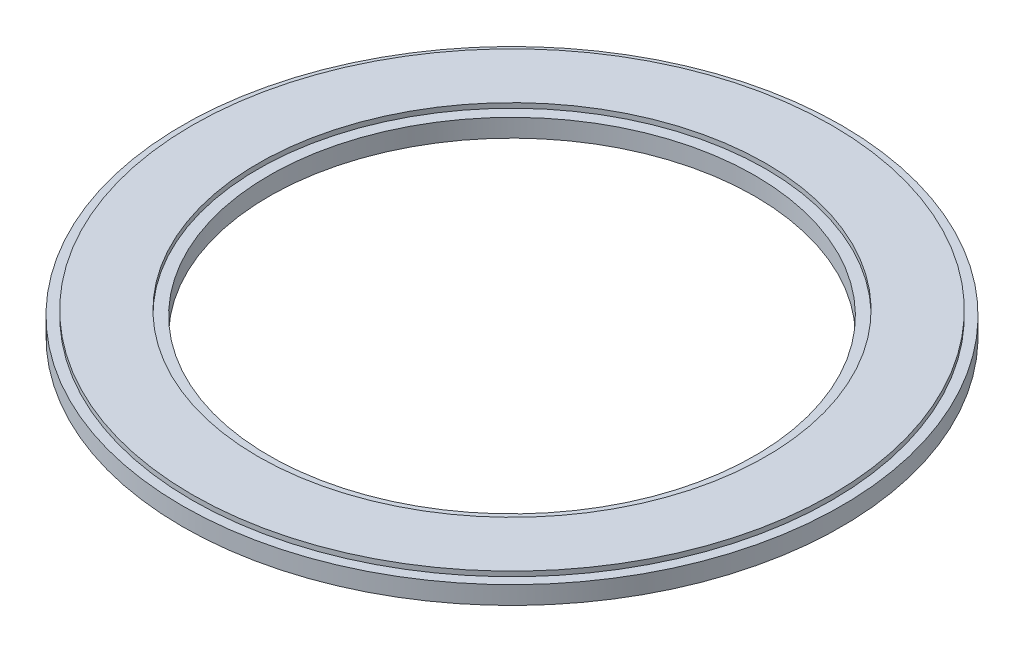
ISO-10303-21;
HEADER;
FILE_DESCRIPTION(('STEP AP214'),'2;1');
FILE_NAME('part.step','',(''),(''),'','','');
FILE_SCHEMA(('AUTOMOTIVE_DESIGN { 1 0 10303 214 1 1 1 1 }'));
ENDSEC;
DATA;
#1=APPLICATION_CONTEXT('core data for automotive mechanical design processes');
#2=APPLICATION_PROTOCOL_DEFINITION('international standard','automotive_design',2000,#1);
#3=PRODUCT_CONTEXT('',#1,'mechanical');
#4=PRODUCT('Part','Part','',(#3));
#5=PRODUCT_RELATED_PRODUCT_CATEGORY('part','',(#4));
#6=PRODUCT_DEFINITION_FORMATION('','',#4);
#7=PRODUCT_DEFINITION_CONTEXT('part definition',#1,'design');
#8=PRODUCT_DEFINITION('design','',#6,#7);
#9=PRODUCT_DEFINITION_SHAPE('','',#8);
#10=(LENGTH_UNIT() NAMED_UNIT(*) SI_UNIT(.MILLI.,.METRE.));
#11=(NAMED_UNIT(*) PLANE_ANGLE_UNIT() SI_UNIT($,.RADIAN.));
#12=(NAMED_UNIT(*) SI_UNIT($,.STERADIAN.) SOLID_ANGLE_UNIT());
#13=UNCERTAINTY_MEASURE_WITH_UNIT(LENGTH_MEASURE(1.E-05),#10,'distance_accuracy_value','');
#14=(GEOMETRIC_REPRESENTATION_CONTEXT(3) GLOBAL_UNCERTAINTY_ASSIGNED_CONTEXT((#13)) GLOBAL_UNIT_ASSIGNED_CONTEXT((#10,
#11,#12)) REPRESENTATION_CONTEXT('',''));
#15=CARTESIAN_POINT('',(0.,0.,0.));
#16=DIRECTION('',(0.,0.,1.));
#17=DIRECTION('',(1.,0.,0.));
#18=AXIS2_PLACEMENT_3D('',#15,#16,#17);
#19=CARTESIAN_POINT('',(0.,0.,0.));
#20=DIRECTION('',(0.,-1.,0.));
#21=DIRECTION('',(0.,0.,-1.));
#22=AXIS2_PLACEMENT_3D('',#19,#20,#21);
#23=CYLINDRICAL_SURFACE('',#22,36.6);
#24=CARTESIAN_POINT('',(0.,0.,0.));
#25=DIRECTION('',(0.,-1.,0.));
#26=DIRECTION('',(0.,0.,-1.));
#27=AXIS2_PLACEMENT_3D('',#24,#25,#26);
#28=CIRCLE('',#27,36.6);
#29=CARTESIAN_POINT('',(0.,0.,-36.6));
#30=VERTEX_POINT('',#29);
#31=EDGE_CURVE('E10',#30,#30,#28,.T.);
#32=ORIENTED_EDGE('',*,*,#31,.T.);
#33=EDGE_LOOP('',(#32));
#34=FACE_BOUND('',#33,.T.);
#35=CARTESIAN_POINT('',(0.,0.7,0.));
#36=DIRECTION('',(0.,-1.,0.));
#37=DIRECTION('',(0.,0.,-1.));
#38=AXIS2_PLACEMENT_3D('',#35,#36,#37);
#39=CIRCLE('',#38,36.6);
#40=CARTESIAN_POINT('',(0.,0.7,-36.6));
#41=VERTEX_POINT('',#40);
#42=EDGE_CURVE('E80',#41,#41,#39,.T.);
#43=ORIENTED_EDGE('',*,*,#42,.F.);
#44=EDGE_LOOP('',(#43));
#45=FACE_BOUND('',#44,.T.);
#46=ADVANCED_FACE('F39',(#34,#45),#23,.F.);
#47=CARTESIAN_POINT('',(36.6,0.,0.));
#48=DIRECTION('',(0.,-1.,0.));
#49=DIRECTION('',(0.,0.,-1.));
#50=AXIS2_PLACEMENT_3D('',#47,#48,#49);
#51=PLANE('',#50);
#52=CARTESIAN_POINT('',(0.,0.,0.));
#53=DIRECTION('',(0.,-1.,0.));
#54=DIRECTION('',(0.,0.,-1.));
#55=AXIS2_PLACEMENT_3D('',#52,#53,#54);
#56=CIRCLE('',#55,46.1);
#57=CARTESIAN_POINT('',(0.,0.,-46.1));
#58=VERTEX_POINT('',#57);
#59=EDGE_CURVE('E44',#58,#58,#56,.T.);
#60=ORIENTED_EDGE('',*,*,#59,.T.);
#61=EDGE_LOOP('',(#60));
#62=FACE_BOUND('',#61,.T.);
#63=ORIENTED_EDGE('',*,*,#31,.F.);
#64=EDGE_LOOP('',(#63));
#65=FACE_BOUND('',#64,.T.);
#66=ADVANCED_FACE('F87',(#62,#65),#51,.T.);
#67=CARTESIAN_POINT('',(0.,0.,0.));
#68=DIRECTION('',(0.,-1.,0.));
#69=DIRECTION('',(0.,0.,-1.));
#70=AXIS2_PLACEMENT_3D('',#67,#68,#69);
#71=CYLINDRICAL_SURFACE('',#70,46.1);
#72=CARTESIAN_POINT('',(0.,0.7,0.));
#73=DIRECTION('',(0.,-1.,0.));
#74=DIRECTION('',(0.,0.,-1.));
#75=AXIS2_PLACEMENT_3D('',#72,#73,#74);
#76=CIRCLE('',#75,46.1);
#77=CARTESIAN_POINT('',(0.,0.7,-46.1));
#78=VERTEX_POINT('',#77);
#79=EDGE_CURVE('E47',#78,#78,#76,.T.);
#80=ORIENTED_EDGE('',*,*,#79,.T.);
#81=EDGE_LOOP('',(#80));
#82=FACE_BOUND('',#81,.T.);
#83=ORIENTED_EDGE('',*,*,#59,.F.);
#84=EDGE_LOOP('',(#83));
#85=FACE_BOUND('',#84,.T.);
#86=ADVANCED_FACE('F93',(#82,#85),#71,.T.);
#87=CARTESIAN_POINT('',(46.1,0.7,0.));
#88=DIRECTION('',(0.,-1.,0.));
#89=DIRECTION('',(0.,0.,-1.));
#90=AXIS2_PLACEMENT_3D('',#87,#88,#89);
#91=PLANE('',#90);
#92=CARTESIAN_POINT('',(0.,0.7,0.));
#93=DIRECTION('',(0.,-1.,0.));
#94=DIRECTION('',(0.,0.,-1.));
#95=AXIS2_PLACEMENT_3D('',#92,#93,#94);
#96=CIRCLE('',#95,47.5);
#97=CARTESIAN_POINT('',(0.,0.7,-47.5));
#98=VERTEX_POINT('',#97);
#99=EDGE_CURVE('E52',#98,#98,#96,.T.);
#100=ORIENTED_EDGE('',*,*,#99,.T.);
#101=EDGE_LOOP('',(#100));
#102=FACE_BOUND('',#101,.T.);
#103=ORIENTED_EDGE('',*,*,#79,.F.);
#104=EDGE_LOOP('',(#103));
#105=FACE_BOUND('',#104,.T.);
#106=ADVANCED_FACE('F92',(#102,#105),#91,.T.);
#107=CARTESIAN_POINT('',(0.,0.,0.));
#108=DIRECTION('',(0.,-1.,0.));
#109=DIRECTION('',(0.,0.,-1.));
#110=AXIS2_PLACEMENT_3D('',#107,#108,#109);
#111=CYLINDRICAL_SURFACE('',#110,47.5);
#112=CARTESIAN_POINT('',(0.,3.3,0.));
#113=DIRECTION('',(0.,-1.,0.));
#114=DIRECTION('',(0.,0.,-1.));
#115=AXIS2_PLACEMENT_3D('',#112,#113,#114);
#116=CIRCLE('',#115,47.5);
#117=CARTESIAN_POINT('',(0.,3.3,-47.5));
#118=VERTEX_POINT('',#117);
#119=EDGE_CURVE('E59',#118,#118,#116,.T.);
#120=ORIENTED_EDGE('',*,*,#119,.T.);
#121=EDGE_LOOP('',(#120));
#122=FACE_BOUND('',#121,.T.);
#123=ORIENTED_EDGE('',*,*,#99,.F.);
#124=EDGE_LOOP('',(#123));
#125=FACE_BOUND('',#124,.T.);
#126=ADVANCED_FACE('F105',(#122,#125),#111,.T.);
#127=CARTESIAN_POINT('',(47.5,3.3,0.));
#128=DIRECTION('',(0.,1.,0.));
#129=DIRECTION('',(0.,0.,1.));
#130=AXIS2_PLACEMENT_3D('',#127,#128,#129);
#131=PLANE('',#130);
#132=CARTESIAN_POINT('',(0.,3.3,0.));
#133=DIRECTION('',(0.,-1.,0.));
#134=DIRECTION('',(0.,0.,-1.));
#135=AXIS2_PLACEMENT_3D('',#132,#133,#134);
#136=CIRCLE('',#135,46.1);
#137=CARTESIAN_POINT('',(0.,3.3,-46.1));
#138=VERTEX_POINT('',#137);
#139=EDGE_CURVE('E63',#138,#138,#136,.T.);
#140=ORIENTED_EDGE('',*,*,#139,.T.);
#141=EDGE_LOOP('',(#140));
#142=FACE_BOUND('',#141,.T.);
#143=ORIENTED_EDGE('',*,*,#119,.F.);
#144=EDGE_LOOP('',(#143));
#145=FACE_BOUND('',#144,.T.);
#146=ADVANCED_FACE('F106',(#142,#145),#131,.T.);
#147=CARTESIAN_POINT('',(0.,0.,0.));
#148=DIRECTION('',(0.,-1.,0.));
#149=DIRECTION('',(0.,0.,-1.));
#150=AXIS2_PLACEMENT_3D('',#147,#148,#149);
#151=CYLINDRICAL_SURFACE('',#150,46.1);
#152=CARTESIAN_POINT('',(0.,4.,0.));
#153=DIRECTION('',(0.,-1.,0.));
#154=DIRECTION('',(0.,0.,-1.));
#155=AXIS2_PLACEMENT_3D('',#152,#153,#154);
#156=CIRCLE('',#155,46.1);
#157=CARTESIAN_POINT('',(0.,4.,-46.1));
#158=VERTEX_POINT('',#157);
#159=EDGE_CURVE('E65',#158,#158,#156,.T.);
#160=ORIENTED_EDGE('',*,*,#159,.T.);
#161=EDGE_LOOP('',(#160));
#162=FACE_BOUND('',#161,.T.);
#163=ORIENTED_EDGE('',*,*,#139,.F.);
#164=EDGE_LOOP('',(#163));
#165=FACE_BOUND('',#164,.T.);
#166=ADVANCED_FACE('F109',(#162,#165),#151,.T.);
#167=CARTESIAN_POINT('',(46.1,4.,0.));
#168=DIRECTION('',(0.,1.,0.));
#169=DIRECTION('',(0.,0.,1.));
#170=AXIS2_PLACEMENT_3D('',#167,#168,#169);
#171=PLANE('',#170);
#172=CARTESIAN_POINT('',(0.,4.,0.));
#173=DIRECTION('',(0.,-1.,0.));
#174=DIRECTION('',(0.,0.,-1.));
#175=AXIS2_PLACEMENT_3D('',#172,#173,#174);
#176=CIRCLE('',#175,36.6);
#177=CARTESIAN_POINT('',(0.,4.,-36.6));
#178=VERTEX_POINT('',#177);
#179=EDGE_CURVE('E69',#178,#178,#176,.T.);
#180=ORIENTED_EDGE('',*,*,#179,.T.);
#181=EDGE_LOOP('',(#180));
#182=FACE_BOUND('',#181,.T.);
#183=ORIENTED_EDGE('',*,*,#159,.F.);
#184=EDGE_LOOP('',(#183));
#185=FACE_BOUND('',#184,.T.);
#186=ADVANCED_FACE('F111',(#182,#185),#171,.T.);
#187=CARTESIAN_POINT('',(0.,0.,0.));
#188=DIRECTION('',(0.,-1.,0.));
#189=DIRECTION('',(0.,0.,-1.));
#190=AXIS2_PLACEMENT_3D('',#187,#188,#189);
#191=CYLINDRICAL_SURFACE('',#190,36.6);
#192=CARTESIAN_POINT('',(0.,3.3,0.));
#193=DIRECTION('',(0.,-1.,0.));
#194=DIRECTION('',(0.,0.,-1.));
#195=AXIS2_PLACEMENT_3D('',#192,#193,#194);
#196=CIRCLE('',#195,36.6);
#197=CARTESIAN_POINT('',(0.,3.3,-36.6));
#198=VERTEX_POINT('',#197);
#199=EDGE_CURVE('E68',#198,#198,#196,.T.);
#200=ORIENTED_EDGE('',*,*,#199,.T.);
#201=EDGE_LOOP('',(#200));
#202=FACE_BOUND('',#201,.T.);
#203=ORIENTED_EDGE('',*,*,#179,.F.);
#204=EDGE_LOOP('',(#203));
#205=FACE_BOUND('',#204,.T.);
#206=ADVANCED_FACE('F117',(#202,#205),#191,.F.);
#207=CARTESIAN_POINT('',(36.6,3.3,0.));
#208=DIRECTION('',(0.,1.,0.));
#209=DIRECTION('',(0.,0.,1.));
#210=AXIS2_PLACEMENT_3D('',#207,#208,#209);
#211=PLANE('',#210);
#212=CARTESIAN_POINT('',(0.,3.3,0.));
#213=DIRECTION('',(0.,-1.,0.));
#214=DIRECTION('',(0.,0.,-1.));
#215=AXIS2_PLACEMENT_3D('',#212,#213,#214);
#216=CIRCLE('',#215,35.);
#217=CARTESIAN_POINT('',(0.,3.3,-35.));
#218=VERTEX_POINT('',#217);
#219=EDGE_CURVE('E71',#218,#218,#216,.T.);
#220=ORIENTED_EDGE('',*,*,#219,.T.);
#221=EDGE_LOOP('',(#220));
#222=FACE_BOUND('',#221,.T.);
#223=ORIENTED_EDGE('',*,*,#199,.F.);
#224=EDGE_LOOP('',(#223));
#225=FACE_BOUND('',#224,.T.);
#226=ADVANCED_FACE('F124',(#222,#225),#211,.T.);
#227=CARTESIAN_POINT('',(0.,0.,0.));
#228=DIRECTION('',(0.,-1.,0.));
#229=DIRECTION('',(0.,0.,-1.));
#230=AXIS2_PLACEMENT_3D('',#227,#228,#229);
#231=CYLINDRICAL_SURFACE('',#230,35.);
#232=CARTESIAN_POINT('',(0.,0.7,0.));
#233=DIRECTION('',(0.,-1.,0.));
#234=DIRECTION('',(0.,0.,-1.));
#235=AXIS2_PLACEMENT_3D('',#232,#233,#234);
#236=CIRCLE('',#235,35.);
#237=CARTESIAN_POINT('',(0.,0.7,-35.));
#238=VERTEX_POINT('',#237);
#239=EDGE_CURVE('E78',#238,#238,#236,.T.);
#240=ORIENTED_EDGE('',*,*,#239,.T.);
#241=EDGE_LOOP('',(#240));
#242=FACE_BOUND('',#241,.T.);
#243=ORIENTED_EDGE('',*,*,#219,.F.);
#244=EDGE_LOOP('',(#243));
#245=FACE_BOUND('',#244,.T.);
#246=ADVANCED_FACE('F127',(#242,#245),#231,.F.);
#247=CARTESIAN_POINT('',(35.,0.7,0.));
#248=DIRECTION('',(0.,-1.,0.));
#249=DIRECTION('',(0.,0.,-1.));
#250=AXIS2_PLACEMENT_3D('',#247,#248,#249);
#251=PLANE('',#250);
#252=ORIENTED_EDGE('',*,*,#42,.T.);
#253=EDGE_LOOP('',(#252));
#254=FACE_BOUND('',#253,.T.);
#255=ORIENTED_EDGE('',*,*,#239,.F.);
#256=EDGE_LOOP('',(#255));
#257=FACE_BOUND('',#256,.T.);
#258=ADVANCED_FACE('F85',(#254,#257),#251,.T.);
#259=CLOSED_SHELL('',(#46,#66,#86,#106,#126,#146,#166,#186,#206,#226,#246,#258));
#260=MANIFOLD_SOLID_BREP('B2',#259);
#261=ADVANCED_BREP_SHAPE_REPRESENTATION('',(#18,#260),#14);
#262=SHAPE_DEFINITION_REPRESENTATION(#9,#261);
ENDSEC;
END-ISO-10303-21;
